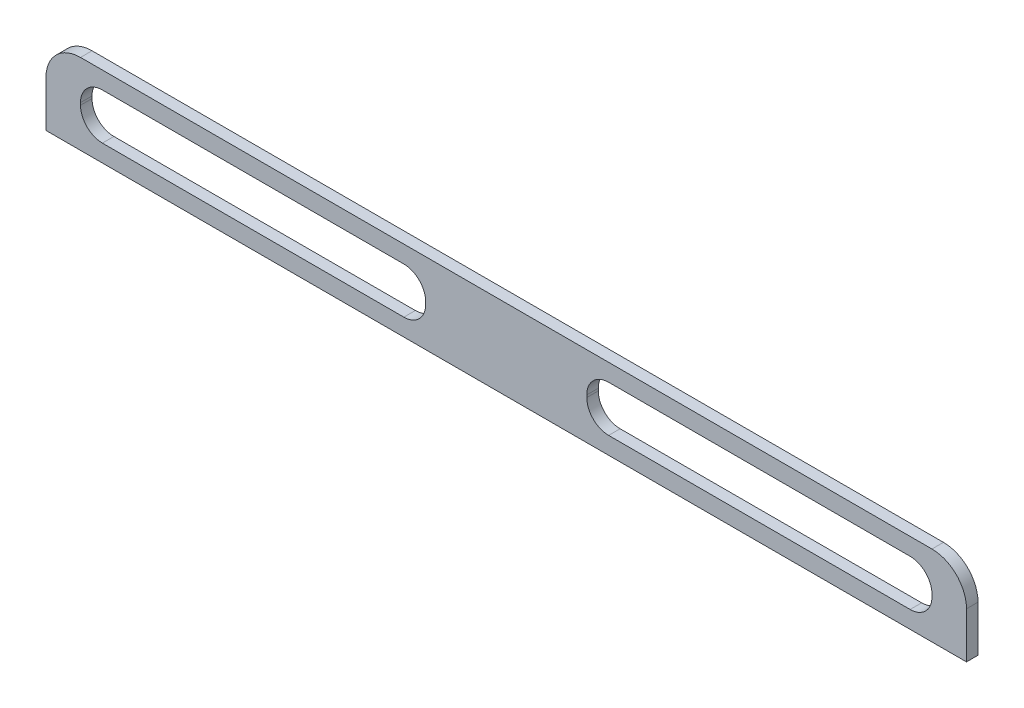
ISO-10303-21;
HEADER;
FILE_DESCRIPTION(('STEP AP214'),'2;1');
FILE_NAME('part.step','',(''),(''),'','','');
FILE_SCHEMA(('AUTOMOTIVE_DESIGN { 1 0 10303 214 1 1 1 1 }'));
ENDSEC;
DATA;
#1=APPLICATION_CONTEXT('core data for automotive mechanical design processes');
#2=APPLICATION_PROTOCOL_DEFINITION('international standard','automotive_design',2000,#1);
#3=PRODUCT_CONTEXT('',#1,'mechanical');
#4=PRODUCT('Part','Part','',(#3));
#5=PRODUCT_RELATED_PRODUCT_CATEGORY('part','',(#4));
#6=PRODUCT_DEFINITION_FORMATION('','',#4);
#7=PRODUCT_DEFINITION_CONTEXT('part definition',#1,'design');
#8=PRODUCT_DEFINITION('design','',#6,#7);
#9=PRODUCT_DEFINITION_SHAPE('','',#8);
#10=(LENGTH_UNIT() NAMED_UNIT(*) SI_UNIT(.MILLI.,.METRE.));
#11=(NAMED_UNIT(*) PLANE_ANGLE_UNIT() SI_UNIT($,.RADIAN.));
#12=(NAMED_UNIT(*) SI_UNIT($,.STERADIAN.) SOLID_ANGLE_UNIT());
#13=UNCERTAINTY_MEASURE_WITH_UNIT(LENGTH_MEASURE(1.E-05),#10,'distance_accuracy_value','');
#14=(GEOMETRIC_REPRESENTATION_CONTEXT(3) GLOBAL_UNCERTAINTY_ASSIGNED_CONTEXT((#13)) GLOBAL_UNIT_ASSIGNED_CONTEXT((#10,
#11,#12)) REPRESENTATION_CONTEXT('',''));
#15=CARTESIAN_POINT('',(0.,0.,0.));
#16=DIRECTION('',(0.,0.,1.));
#17=DIRECTION('',(1.,0.,0.));
#18=AXIS2_PLACEMENT_3D('',#15,#16,#17);
#19=CARTESIAN_POINT('',(400.,-35.0000000000001,-10.));
#20=DIRECTION('',(1.,0.,0.));
#21=DIRECTION('',(0.,0.,-1.));
#22=AXIS2_PLACEMENT_3D('',#19,#20,#21);
#23=PLANE('',#22);
#24=DIRECTION('',(0.,1.,0.));
#25=VECTOR('',#24,1.);
#26=CARTESIAN_POINT('',(400.,-35.0000000000001,0.));
#27=LINE('',#26,#25);
#28=CARTESIAN_POINT('',(400.,-35.0000000000001,0.));
#29=VERTEX_POINT('',#28);
#30=CARTESIAN_POINT('',(400.,5.00000000000013,0.));
#31=VERTEX_POINT('',#30);
#32=EDGE_CURVE('E306',#29,#31,#27,.T.);
#33=ORIENTED_EDGE('',*,*,#32,.F.);
#34=DIRECTION('',(0.,0.,1.));
#35=VECTOR('',#34,1.);
#36=CARTESIAN_POINT('',(400.,-35.0000000000001,-10.));
#37=LINE('',#36,#35);
#38=CARTESIAN_POINT('',(400.,-35.0000000000001,-10.));
#39=VERTEX_POINT('',#38);
#40=EDGE_CURVE('E11',#39,#29,#37,.T.);
#41=ORIENTED_EDGE('',*,*,#40,.F.);
#42=DIRECTION('',(0.,1.,0.));
#43=VECTOR('',#42,1.);
#44=CARTESIAN_POINT('',(400.,-35.0000000000001,-10.));
#45=LINE('',#44,#43);
#46=CARTESIAN_POINT('',(400.,5.00000000000013,-10.));
#47=VERTEX_POINT('',#46);
#48=EDGE_CURVE('E321',#39,#47,#45,.T.);
#49=ORIENTED_EDGE('',*,*,#48,.T.);
#50=DIRECTION('',(0.,0.,1.));
#51=VECTOR('',#50,1.);
#52=CARTESIAN_POINT('',(400.,5.00000000000013,-10.));
#53=LINE('',#52,#51);
#54=EDGE_CURVE('E42',#47,#31,#53,.T.);
#55=ORIENTED_EDGE('',*,*,#54,.T.);
#56=EDGE_LOOP('',(#33,#41,#49,#55));
#57=FACE_BOUND('',#56,.T.);
#58=ADVANCED_FACE('F39',(#57),#23,.T.);
#59=CARTESIAN_POINT('',(400.,-35.0000000000001,-10.));
#60=DIRECTION('',(0.,-1.,0.));
#61=DIRECTION('',(1.,0.,0.));
#62=AXIS2_PLACEMENT_3D('',#59,#60,#61);
#63=PLANE('',#62);
#64=DIRECTION('',(1.,0.,0.));
#65=VECTOR('',#64,1.);
#66=CARTESIAN_POINT('',(400.,-35.0000000000001,0.));
#67=LINE('',#66,#65);
#68=CARTESIAN_POINT('',(-400.,-35.,0.));
#69=VERTEX_POINT('',#68);
#70=EDGE_CURVE('E325',#69,#29,#67,.T.);
#71=ORIENTED_EDGE('',*,*,#70,.F.);
#72=DIRECTION('',(0.,0.,1.));
#73=VECTOR('',#72,1.);
#74=CARTESIAN_POINT('',(-400.,-35.,-10.));
#75=LINE('',#74,#73);
#76=CARTESIAN_POINT('',(-400.,-35.,-10.));
#77=VERTEX_POINT('',#76);
#78=EDGE_CURVE('E47',#77,#69,#75,.T.);
#79=ORIENTED_EDGE('',*,*,#78,.F.);
#80=DIRECTION('',(1.,0.,0.));
#81=VECTOR('',#80,1.);
#82=CARTESIAN_POINT('',(400.,-35.0000000000001,-10.));
#83=LINE('',#82,#81);
#84=EDGE_CURVE('E337',#77,#39,#83,.T.);
#85=ORIENTED_EDGE('',*,*,#84,.T.);
#86=ORIENTED_EDGE('',*,*,#40,.T.);
#87=EDGE_LOOP('',(#71,#79,#85,#86));
#88=FACE_BOUND('',#87,.T.);
#89=ADVANCED_FACE('F374',(#88),#63,.T.);
#90=CARTESIAN_POINT('',(-400.,-35.,-10.));
#91=DIRECTION('',(-1.,0.,0.));
#92=DIRECTION('',(0.,-1.,0.));
#93=AXIS2_PLACEMENT_3D('',#90,#91,#92);
#94=PLANE('',#93);
#95=DIRECTION('',(0.,-1.,0.));
#96=VECTOR('',#95,1.);
#97=CARTESIAN_POINT('',(-400.,-35.,0.));
#98=LINE('',#97,#96);
#99=CARTESIAN_POINT('',(-400.,4.99999999999998,0.));
#100=VERTEX_POINT('',#99);
#101=EDGE_CURVE('E351',#100,#69,#98,.T.);
#102=ORIENTED_EDGE('',*,*,#101,.F.);
#103=DIRECTION('',(0.,0.,1.));
#104=VECTOR('',#103,1.);
#105=CARTESIAN_POINT('',(-400.,4.99999999999998,-10.));
#106=LINE('',#105,#104);
#107=CARTESIAN_POINT('',(-400.,4.99999999999998,-10.));
#108=VERTEX_POINT('',#107);
#109=EDGE_CURVE('E357',#108,#100,#106,.T.);
#110=ORIENTED_EDGE('',*,*,#109,.F.);
#111=DIRECTION('',(0.,-1.,0.));
#112=VECTOR('',#111,1.);
#113=CARTESIAN_POINT('',(-400.,-35.,-10.));
#114=LINE('',#113,#112);
#115=EDGE_CURVE('E334',#108,#77,#114,.T.);
#116=ORIENTED_EDGE('',*,*,#115,.T.);
#117=ORIENTED_EDGE('',*,*,#78,.T.);
#118=EDGE_LOOP('',(#102,#110,#116,#117));
#119=FACE_BOUND('',#118,.T.);
#120=ADVANCED_FACE('F386',(#119),#94,.T.);
#121=CARTESIAN_POINT('',(-370.,4.99999999999998,-10.));
#122=DIRECTION('',(0.,0.,1.));
#123=DIRECTION('',(1.,0.,0.));
#124=AXIS2_PLACEMENT_3D('',#121,#122,#123);
#125=CYLINDRICAL_SURFACE('',#124,30.);
#126=CARTESIAN_POINT('',(-370.,4.99999999999998,0.));
#127=DIRECTION('',(0.,0.,1.));
#128=DIRECTION('',(1.,0.,0.));
#129=AXIS2_PLACEMENT_3D('',#126,#127,#128);
#130=CIRCLE('',#129,30.);
#131=CARTESIAN_POINT('',(-370.,35.,0.));
#132=VERTEX_POINT('',#131);
#133=EDGE_CURVE('E348',#132,#100,#130,.T.);
#134=ORIENTED_EDGE('',*,*,#133,.F.);
#135=DIRECTION('',(0.,0.,1.));
#136=VECTOR('',#135,1.);
#137=CARTESIAN_POINT('',(-370.,35.,-10.));
#138=LINE('',#137,#136);
#139=CARTESIAN_POINT('',(-370.,35.,-10.));
#140=VERTEX_POINT('',#139);
#141=EDGE_CURVE('E359',#140,#132,#138,.T.);
#142=ORIENTED_EDGE('',*,*,#141,.F.);
#143=CARTESIAN_POINT('',(-370.,4.99999999999998,-10.));
#144=DIRECTION('',(0.,0.,1.));
#145=DIRECTION('',(1.,0.,0.));
#146=AXIS2_PLACEMENT_3D('',#143,#144,#145);
#147=CIRCLE('',#146,30.);
#148=EDGE_CURVE('E331',#140,#108,#147,.T.);
#149=ORIENTED_EDGE('',*,*,#148,.T.);
#150=ORIENTED_EDGE('',*,*,#109,.T.);
#151=EDGE_LOOP('',(#134,#142,#149,#150));
#152=FACE_BOUND('',#151,.T.);
#153=ADVANCED_FACE('F384',(#152),#125,.T.);
#154=CARTESIAN_POINT('',(370.,35.0000000000001,-10.));
#155=DIRECTION('',(0.,1.,0.));
#156=DIRECTION('',(-1.,0.,0.));
#157=AXIS2_PLACEMENT_3D('',#154,#155,#156);
#158=PLANE('',#157);
#159=DIRECTION('',(-1.,0.,0.));
#160=VECTOR('',#159,1.);
#161=CARTESIAN_POINT('',(370.,35.0000000000001,0.));
#162=LINE('',#161,#160);
#163=CARTESIAN_POINT('',(370.,35.0000000000001,0.));
#164=VERTEX_POINT('',#163);
#165=EDGE_CURVE('E345',#164,#132,#162,.T.);
#166=ORIENTED_EDGE('',*,*,#165,.F.);
#167=DIRECTION('',(0.,0.,1.));
#168=VECTOR('',#167,1.);
#169=CARTESIAN_POINT('',(370.,35.0000000000001,-10.));
#170=LINE('',#169,#168);
#171=CARTESIAN_POINT('',(370.,35.0000000000001,-10.));
#172=VERTEX_POINT('',#171);
#173=EDGE_CURVE('E360',#172,#164,#170,.T.);
#174=ORIENTED_EDGE('',*,*,#173,.F.);
#175=DIRECTION('',(-1.,0.,0.));
#176=VECTOR('',#175,1.);
#177=CARTESIAN_POINT('',(370.,35.0000000000001,-10.));
#178=LINE('',#177,#176);
#179=EDGE_CURVE('E328',#172,#140,#178,.T.);
#180=ORIENTED_EDGE('',*,*,#179,.T.);
#181=ORIENTED_EDGE('',*,*,#141,.T.);
#182=EDGE_LOOP('',(#166,#174,#180,#181));
#183=FACE_BOUND('',#182,.T.);
#184=ADVANCED_FACE('F381',(#183),#158,.T.);
#185=CARTESIAN_POINT('',(370.,5.00000000000013,-10.));
#186=DIRECTION('',(0.,0.,1.));
#187=DIRECTION('',(1.,0.,0.));
#188=AXIS2_PLACEMENT_3D('',#185,#186,#187);
#189=CYLINDRICAL_SURFACE('',#188,30.);
#190=CARTESIAN_POINT('',(370.,5.00000000000013,0.));
#191=DIRECTION('',(0.,0.,1.));
#192=DIRECTION('',(1.,0.,0.));
#193=AXIS2_PLACEMENT_3D('',#190,#191,#192);
#194=CIRCLE('',#193,30.);
#195=EDGE_CURVE('E342',#31,#164,#194,.T.);
#196=ORIENTED_EDGE('',*,*,#195,.F.);
#197=ORIENTED_EDGE('',*,*,#54,.F.);
#198=CARTESIAN_POINT('',(370.,5.00000000000013,-10.));
#199=DIRECTION('',(0.,0.,1.));
#200=DIRECTION('',(1.,0.,0.));
#201=AXIS2_PLACEMENT_3D('',#198,#199,#200);
#202=CIRCLE('',#201,30.);
#203=EDGE_CURVE('E324',#47,#172,#202,.T.);
#204=ORIENTED_EDGE('',*,*,#203,.T.);
#205=ORIENTED_EDGE('',*,*,#173,.T.);
#206=EDGE_LOOP('',(#196,#197,#204,#205));
#207=FACE_BOUND('',#206,.T.);
#208=ADVANCED_FACE('F368',(#207),#189,.T.);
#209=CARTESIAN_POINT('',(370.,5.00000000000013,-10.));
#210=DIRECTION('',(0.,0.,1.));
#211=DIRECTION('',(1.,0.,0.));
#212=AXIS2_PLACEMENT_3D('',#209,#210,#211);
#213=PLANE('',#212);
#214=DIRECTION('',(0.,-1.,0.));
#215=VECTOR('',#214,1.);
#216=CARTESIAN_POINT('',(70.0000000000005,0.999999999999421,-10.));
#217=LINE('',#216,#215);
#218=CARTESIAN_POINT('',(70.0000000000005,0.999999999999429,-10.));
#219=VERTEX_POINT('',#218);
#220=CARTESIAN_POINT('',(70.0000000000005,-0.999999999999907,-10.));
#221=VERTEX_POINT('',#220);
#222=EDGE_CURVE('E196',#219,#221,#217,.T.);
#223=ORIENTED_EDGE('',*,*,#222,.T.);
#224=CARTESIAN_POINT('',(89.0000000000004,-1.00000000000004,-10.));
#225=DIRECTION('',(0.,0.,1.));
#226=DIRECTION('',(-1.,0.,0.));
#227=AXIS2_PLACEMENT_3D('',#224,#225,#226);
#228=CIRCLE('',#227,19.);
#229=CARTESIAN_POINT('',(89.0000000000006,-20.,-10.));
#230=VERTEX_POINT('',#229);
#231=EDGE_CURVE('E190',#221,#230,#228,.T.);
#232=ORIENTED_EDGE('',*,*,#231,.T.);
#233=DIRECTION('',(1.,0.,0.));
#234=VECTOR('',#233,1.);
#235=CARTESIAN_POINT('',(351.,-20.,-10.));
#236=LINE('',#235,#234);
#237=CARTESIAN_POINT('',(351.,-20.,-10.));
#238=VERTEX_POINT('',#237);
#239=EDGE_CURVE('E199',#230,#238,#236,.T.);
#240=ORIENTED_EDGE('',*,*,#239,.T.);
#241=CARTESIAN_POINT('',(351.,-1.00000000000001,-10.));
#242=DIRECTION('',(0.,0.,1.));
#243=DIRECTION('',(1.,0.,0.));
#244=AXIS2_PLACEMENT_3D('',#241,#242,#243);
#245=CIRCLE('',#244,19.);
#246=CARTESIAN_POINT('',(370.,-1.00000000000001,-10.));
#247=VERTEX_POINT('',#246);
#248=EDGE_CURVE('E55',#238,#247,#245,.T.);
#249=ORIENTED_EDGE('',*,*,#248,.T.);
#250=DIRECTION('',(0.,1.,0.));
#251=VECTOR('',#250,1.);
#252=CARTESIAN_POINT('',(370.,0.999999999999841,-10.));
#253=LINE('',#252,#251);
#254=CARTESIAN_POINT('',(370.,0.999999999999841,-10.));
#255=VERTEX_POINT('',#254);
#256=EDGE_CURVE('E214',#247,#255,#253,.T.);
#257=ORIENTED_EDGE('',*,*,#256,.T.);
#258=CARTESIAN_POINT('',(351.,0.999999999999973,-10.));
#259=DIRECTION('',(0.,0.,1.));
#260=DIRECTION('',(-1.,0.,0.));
#261=AXIS2_PLACEMENT_3D('',#258,#259,#260);
#262=CIRCLE('',#261,19.);
#263=CARTESIAN_POINT('',(351.,20.,-10.));
#264=VERTEX_POINT('',#263);
#265=EDGE_CURVE('E217',#255,#264,#262,.T.);
#266=ORIENTED_EDGE('',*,*,#265,.T.);
#267=DIRECTION('',(-1.,0.,0.));
#268=VECTOR('',#267,1.);
#269=CARTESIAN_POINT('',(351.,20.,-10.));
#270=LINE('',#269,#268);
#271=CARTESIAN_POINT('',(89.0000000000006,19.9999999999996,-10.));
#272=VERTEX_POINT('',#271);
#273=EDGE_CURVE('E220',#264,#272,#270,.T.);
#274=ORIENTED_EDGE('',*,*,#273,.T.);
#275=CARTESIAN_POINT('',(89.0000000000004,0.999999999999553,-10.));
#276=DIRECTION('',(0.,0.,1.));
#277=DIRECTION('',(1.,0.,0.));
#278=AXIS2_PLACEMENT_3D('',#275,#276,#277);
#279=CIRCLE('',#278,19.);
#280=EDGE_CURVE('E223',#272,#219,#279,.T.);
#281=ORIENTED_EDGE('',*,*,#280,.T.);
#282=EDGE_LOOP('',(#223,#232,#240,#249,#257,#266,#274,#281));
#283=FACE_BOUND('',#282,.T.);
#284=DIRECTION('',(1.,0.,0.));
#285=VECTOR('',#284,1.);
#286=CARTESIAN_POINT('',(-88.9999999999998,-19.9999999999999,-10.));
#287=LINE('',#286,#285);
#288=CARTESIAN_POINT('',(-351.,-19.9999999999999,-10.));
#289=VERTEX_POINT('',#288);
#290=CARTESIAN_POINT('',(-88.9999999999998,-19.9999999999999,-10.));
#291=VERTEX_POINT('',#290);
#292=EDGE_CURVE('E279',#289,#291,#287,.T.);
#293=ORIENTED_EDGE('',*,*,#292,.T.);
#294=CARTESIAN_POINT('',(-88.9999999999997,-0.999999999999866,-10.));
#295=DIRECTION('',(0.,0.,1.));
#296=DIRECTION('',(1.,0.,0.));
#297=AXIS2_PLACEMENT_3D('',#294,#295,#296);
#298=CIRCLE('',#297,19.);
#299=CARTESIAN_POINT('',(-69.9999999999997,-0.999999999999727,-10.));
#300=VERTEX_POINT('',#299);
#301=EDGE_CURVE('E257',#291,#300,#298,.T.);
#302=ORIENTED_EDGE('',*,*,#301,.T.);
#303=DIRECTION('',(0.,1.,0.));
#304=VECTOR('',#303,1.);
#305=CARTESIAN_POINT('',(-69.9999999999997,0.999999999999789,-10.));
#306=LINE('',#305,#304);
#307=CARTESIAN_POINT('',(-69.9999999999997,0.999999999999792,-10.));
#308=VERTEX_POINT('',#307);
#309=EDGE_CURVE('E260',#300,#308,#306,.T.);
#310=ORIENTED_EDGE('',*,*,#309,.T.);
#311=CARTESIAN_POINT('',(-88.9999999999997,0.999999999999925,-10.));
#312=DIRECTION('',(0.,0.,1.));
#313=DIRECTION('',(-1.,0.,0.));
#314=AXIS2_PLACEMENT_3D('',#311,#312,#313);
#315=CIRCLE('',#314,19.);
#316=CARTESIAN_POINT('',(-88.9999999999998,19.9999999999999,-10.));
#317=VERTEX_POINT('',#316);
#318=EDGE_CURVE('E264',#308,#317,#315,.T.);
#319=ORIENTED_EDGE('',*,*,#318,.T.);
#320=DIRECTION('',(-1.,0.,0.));
#321=VECTOR('',#320,1.);
#322=CARTESIAN_POINT('',(-88.9999999999998,19.9999999999999,-10.));
#323=LINE('',#322,#321);
#324=CARTESIAN_POINT('',(-351.,19.9999999999999,-10.));
#325=VERTEX_POINT('',#324);
#326=EDGE_CURVE('E267',#317,#325,#323,.T.);
#327=ORIENTED_EDGE('',*,*,#326,.T.);
#328=CARTESIAN_POINT('',(-351.,0.999999999999883,-10.));
#329=DIRECTION('',(0.,0.,1.));
#330=DIRECTION('',(1.,0.,0.));
#331=AXIS2_PLACEMENT_3D('',#328,#329,#330);
#332=CIRCLE('',#331,19.);
#333=CARTESIAN_POINT('',(-370.,0.999999999999744,-10.));
#334=VERTEX_POINT('',#333);
#335=EDGE_CURVE('E270',#325,#334,#332,.T.);
#336=ORIENTED_EDGE('',*,*,#335,.T.);
#337=DIRECTION('',(0.,-1.,0.));
#338=VECTOR('',#337,1.);
#339=CARTESIAN_POINT('',(-370.,0.999999999999744,-10.));
#340=LINE('',#339,#338);
#341=CARTESIAN_POINT('',(-370.,-0.999999999999907,-10.));
#342=VERTEX_POINT('',#341);
#343=EDGE_CURVE('E273',#334,#342,#340,.T.);
#344=ORIENTED_EDGE('',*,*,#343,.T.);
#345=CARTESIAN_POINT('',(-351.,-0.999999999999907,-10.));
#346=DIRECTION('',(0.,0.,1.));
#347=DIRECTION('',(-1.,0.,0.));
#348=AXIS2_PLACEMENT_3D('',#345,#346,#347);
#349=CIRCLE('',#348,19.);
#350=EDGE_CURVE('E276',#342,#289,#349,.T.);
#351=ORIENTED_EDGE('',*,*,#350,.T.);
#352=EDGE_LOOP('',(#293,#302,#310,#319,#327,#336,#344,#351));
#353=FACE_BOUND('',#352,.T.);
#354=ORIENTED_EDGE('',*,*,#48,.F.);
#355=ORIENTED_EDGE('',*,*,#84,.F.);
#356=ORIENTED_EDGE('',*,*,#115,.F.);
#357=ORIENTED_EDGE('',*,*,#148,.F.);
#358=ORIENTED_EDGE('',*,*,#179,.F.);
#359=ORIENTED_EDGE('',*,*,#203,.F.);
#360=EDGE_LOOP('',(#354,#355,#356,#357,#358,#359));
#361=FACE_BOUND('',#360,.T.);
#362=ADVANCED_FACE('F203',(#283,#353,#361),#213,.F.);
#363=CARTESIAN_POINT('',(370.,5.00000000000013,0.));
#364=DIRECTION('',(0.,0.,1.));
#365=DIRECTION('',(1.,0.,0.));
#366=AXIS2_PLACEMENT_3D('',#363,#364,#365);
#367=PLANE('',#366);
#368=CARTESIAN_POINT('',(89.0000000000004,-1.00000000000004,0.));
#369=DIRECTION('',(0.,0.,1.));
#370=DIRECTION('',(-1.,0.,0.));
#371=AXIS2_PLACEMENT_3D('',#368,#369,#370);
#372=CIRCLE('',#371,19.);
#373=CARTESIAN_POINT('',(70.0000000000005,-0.999999999999907,0.));
#374=VERTEX_POINT('',#373);
#375=CARTESIAN_POINT('',(89.0000000000006,-20.,0.));
#376=VERTEX_POINT('',#375);
#377=EDGE_CURVE('E63',#374,#376,#372,.T.);
#378=ORIENTED_EDGE('',*,*,#377,.F.);
#379=DIRECTION('',(0.,-1.,0.));
#380=VECTOR('',#379,1.);
#381=CARTESIAN_POINT('',(70.0000000000005,0.999999999999421,0.));
#382=LINE('',#381,#380);
#383=CARTESIAN_POINT('',(70.0000000000005,0.999999999999429,0.));
#384=VERTEX_POINT('',#383);
#385=EDGE_CURVE('E207',#384,#374,#382,.T.);
#386=ORIENTED_EDGE('',*,*,#385,.F.);
#387=CARTESIAN_POINT('',(89.0000000000004,0.999999999999553,0.));
#388=DIRECTION('',(0.,0.,1.));
#389=DIRECTION('',(1.,0.,0.));
#390=AXIS2_PLACEMENT_3D('',#387,#388,#389);
#391=CIRCLE('',#390,19.);
#392=CARTESIAN_POINT('',(89.0000000000006,19.9999999999996,0.));
#393=VERTEX_POINT('',#392);
#394=EDGE_CURVE('E210',#393,#384,#391,.T.);
#395=ORIENTED_EDGE('',*,*,#394,.F.);
#396=DIRECTION('',(-1.,0.,0.));
#397=VECTOR('',#396,1.);
#398=CARTESIAN_POINT('',(351.,20.,0.));
#399=LINE('',#398,#397);
#400=CARTESIAN_POINT('',(351.,20.,0.));
#401=VERTEX_POINT('',#400);
#402=EDGE_CURVE('E238',#401,#393,#399,.T.);
#403=ORIENTED_EDGE('',*,*,#402,.F.);
#404=CARTESIAN_POINT('',(351.,0.999999999999973,0.));
#405=DIRECTION('',(0.,0.,1.));
#406=DIRECTION('',(-1.,0.,0.));
#407=AXIS2_PLACEMENT_3D('',#404,#405,#406);
#408=CIRCLE('',#407,19.);
#409=CARTESIAN_POINT('',(370.,0.999999999999841,0.));
#410=VERTEX_POINT('',#409);
#411=EDGE_CURVE('E235',#410,#401,#408,.T.);
#412=ORIENTED_EDGE('',*,*,#411,.F.);
#413=DIRECTION('',(0.,1.,0.));
#414=VECTOR('',#413,1.);
#415=CARTESIAN_POINT('',(370.,0.999999999999841,0.));
#416=LINE('',#415,#414);
#417=CARTESIAN_POINT('',(370.,-1.00000000000001,0.));
#418=VERTEX_POINT('',#417);
#419=EDGE_CURVE('E232',#418,#410,#416,.T.);
#420=ORIENTED_EDGE('',*,*,#419,.F.);
#421=CARTESIAN_POINT('',(351.,-1.00000000000001,0.));
#422=DIRECTION('',(0.,0.,1.));
#423=DIRECTION('',(1.,0.,0.));
#424=AXIS2_PLACEMENT_3D('',#421,#422,#423);
#425=CIRCLE('',#424,19.);
#426=CARTESIAN_POINT('',(351.,-20.,0.));
#427=VERTEX_POINT('',#426);
#428=EDGE_CURVE('E229',#427,#418,#425,.T.);
#429=ORIENTED_EDGE('',*,*,#428,.F.);
#430=DIRECTION('',(1.,0.,0.));
#431=VECTOR('',#430,1.);
#432=CARTESIAN_POINT('',(351.,-20.,0.));
#433=LINE('',#432,#431);
#434=EDGE_CURVE('E227',#376,#427,#433,.T.);
#435=ORIENTED_EDGE('',*,*,#434,.F.);
#436=EDGE_LOOP('',(#378,#386,#395,#403,#412,#420,#429,#435));
#437=FACE_BOUND('',#436,.T.);
#438=CARTESIAN_POINT('',(-88.9999999999997,-0.999999999999866,0.));
#439=DIRECTION('',(0.,0.,1.));
#440=DIRECTION('',(1.,0.,0.));
#441=AXIS2_PLACEMENT_3D('',#438,#439,#440);
#442=CIRCLE('',#441,19.);
#443=CARTESIAN_POINT('',(-88.9999999999998,-19.9999999999999,0.));
#444=VERTEX_POINT('',#443);
#445=CARTESIAN_POINT('',(-69.9999999999997,-0.999999999999727,0.));
#446=VERTEX_POINT('',#445);
#447=EDGE_CURVE('E245',#444,#446,#442,.T.);
#448=ORIENTED_EDGE('',*,*,#447,.F.);
#449=DIRECTION('',(1.,0.,0.));
#450=VECTOR('',#449,1.);
#451=CARTESIAN_POINT('',(-88.9999999999998,-19.9999999999999,0.));
#452=LINE('',#451,#450);
#453=CARTESIAN_POINT('',(-351.,-19.9999999999999,0.));
#454=VERTEX_POINT('',#453);
#455=EDGE_CURVE('E261',#454,#444,#452,.T.);
#456=ORIENTED_EDGE('',*,*,#455,.F.);
#457=CARTESIAN_POINT('',(-351.,-0.999999999999907,0.));
#458=DIRECTION('',(0.,0.,1.));
#459=DIRECTION('',(-1.,0.,0.));
#460=AXIS2_PLACEMENT_3D('',#457,#458,#459);
#461=CIRCLE('',#460,19.);
#462=CARTESIAN_POINT('',(-370.,-0.999999999999907,0.));
#463=VERTEX_POINT('',#462);
#464=EDGE_CURVE('E299',#463,#454,#461,.T.);
#465=ORIENTED_EDGE('',*,*,#464,.F.);
#466=DIRECTION('',(0.,-1.,0.));
#467=VECTOR('',#466,1.);
#468=CARTESIAN_POINT('',(-370.,0.999999999999744,0.));
#469=LINE('',#468,#467);
#470=CARTESIAN_POINT('',(-370.,0.999999999999744,0.));
#471=VERTEX_POINT('',#470);
#472=EDGE_CURVE('E296',#471,#463,#469,.T.);
#473=ORIENTED_EDGE('',*,*,#472,.F.);
#474=CARTESIAN_POINT('',(-351.,0.999999999999883,0.));
#475=DIRECTION('',(0.,0.,1.));
#476=DIRECTION('',(1.,0.,0.));
#477=AXIS2_PLACEMENT_3D('',#474,#475,#476);
#478=CIRCLE('',#477,19.);
#479=CARTESIAN_POINT('',(-351.,19.9999999999999,0.));
#480=VERTEX_POINT('',#479);
#481=EDGE_CURVE('E293',#480,#471,#478,.T.);
#482=ORIENTED_EDGE('',*,*,#481,.F.);
#483=DIRECTION('',(-1.,0.,0.));
#484=VECTOR('',#483,1.);
#485=CARTESIAN_POINT('',(-88.9999999999998,19.9999999999999,0.));
#486=LINE('',#485,#484);
#487=CARTESIAN_POINT('',(-88.9999999999998,19.9999999999999,0.));
#488=VERTEX_POINT('',#487);
#489=EDGE_CURVE('E290',#488,#480,#486,.T.);
#490=ORIENTED_EDGE('',*,*,#489,.F.);
#491=CARTESIAN_POINT('',(-88.9999999999997,0.999999999999925,0.));
#492=DIRECTION('',(0.,0.,1.));
#493=DIRECTION('',(-1.,0.,0.));
#494=AXIS2_PLACEMENT_3D('',#491,#492,#493);
#495=CIRCLE('',#494,19.);
#496=CARTESIAN_POINT('',(-69.9999999999997,0.999999999999792,0.));
#497=VERTEX_POINT('',#496);
#498=EDGE_CURVE('E287',#497,#488,#495,.T.);
#499=ORIENTED_EDGE('',*,*,#498,.F.);
#500=DIRECTION('',(0.,1.,0.));
#501=VECTOR('',#500,1.);
#502=CARTESIAN_POINT('',(-69.9999999999997,0.999999999999789,0.));
#503=LINE('',#502,#501);
#504=EDGE_CURVE('E284',#446,#497,#503,.T.);
#505=ORIENTED_EDGE('',*,*,#504,.F.);
#506=EDGE_LOOP('',(#448,#456,#465,#473,#482,#490,#499,#505));
#507=FACE_BOUND('',#506,.T.);
#508=ORIENTED_EDGE('',*,*,#32,.T.);
#509=ORIENTED_EDGE('',*,*,#195,.T.);
#510=ORIENTED_EDGE('',*,*,#165,.T.);
#511=ORIENTED_EDGE('',*,*,#133,.T.);
#512=ORIENTED_EDGE('',*,*,#101,.T.);
#513=ORIENTED_EDGE('',*,*,#70,.T.);
#514=EDGE_LOOP('',(#508,#509,#510,#511,#512,#513));
#515=FACE_BOUND('',#514,.T.);
#516=ADVANCED_FACE('F370',(#437,#507,#515),#367,.T.);
#517=CARTESIAN_POINT('',(-88.9999999999997,-0.999999999999866,-10.));
#518=DIRECTION('',(0.,0.,1.));
#519=DIRECTION('',(1.,0.,0.));
#520=AXIS2_PLACEMENT_3D('',#517,#518,#519);
#521=CYLINDRICAL_SURFACE('',#520,19.);
#522=ORIENTED_EDGE('',*,*,#447,.T.);
#523=DIRECTION('',(0.,0.,1.));
#524=VECTOR('',#523,1.);
#525=CARTESIAN_POINT('',(-69.9999999999997,-0.999999999999727,-10.));
#526=LINE('',#525,#524);
#527=EDGE_CURVE('E282',#300,#446,#526,.T.);
#528=ORIENTED_EDGE('',*,*,#527,.F.);
#529=ORIENTED_EDGE('',*,*,#301,.F.);
#530=DIRECTION('',(0.,0.,1.));
#531=VECTOR('',#530,1.);
#532=CARTESIAN_POINT('',(-88.9999999999998,-19.9999999999999,-10.));
#533=LINE('',#532,#531);
#534=EDGE_CURVE('E304',#291,#444,#533,.T.);
#535=ORIENTED_EDGE('',*,*,#534,.T.);
#536=EDGE_LOOP('',(#522,#528,#529,#535));
#537=FACE_BOUND('',#536,.T.);
#538=ADVANCED_FACE('F450',(#537),#521,.F.);
#539=CARTESIAN_POINT('',(-88.9999999999998,-19.9999999999999,-10.));
#540=DIRECTION('',(0.,-1.,0.));
#541=DIRECTION('',(1.,0.,0.));
#542=AXIS2_PLACEMENT_3D('',#539,#540,#541);
#543=PLANE('',#542);
#544=ORIENTED_EDGE('',*,*,#455,.T.);
#545=ORIENTED_EDGE('',*,*,#534,.F.);
#546=ORIENTED_EDGE('',*,*,#292,.F.);
#547=DIRECTION('',(0.,0.,1.));
#548=VECTOR('',#547,1.);
#549=CARTESIAN_POINT('',(-351.,-19.9999999999999,-10.));
#550=LINE('',#549,#548);
#551=EDGE_CURVE('E307',#289,#454,#550,.T.);
#552=ORIENTED_EDGE('',*,*,#551,.T.);
#553=EDGE_LOOP('',(#544,#545,#546,#552));
#554=FACE_BOUND('',#553,.T.);
#555=ADVANCED_FACE('F461',(#554),#543,.F.);
#556=CARTESIAN_POINT('',(-351.,-0.999999999999907,-10.));
#557=DIRECTION('',(0.,0.,1.));
#558=DIRECTION('',(1.,0.,0.));
#559=AXIS2_PLACEMENT_3D('',#556,#557,#558);
#560=CYLINDRICAL_SURFACE('',#559,19.);
#561=ORIENTED_EDGE('',*,*,#464,.T.);
#562=ORIENTED_EDGE('',*,*,#551,.F.);
#563=ORIENTED_EDGE('',*,*,#350,.F.);
#564=DIRECTION('',(0.,0.,1.));
#565=VECTOR('',#564,1.);
#566=CARTESIAN_POINT('',(-370.,-0.999999999999907,-10.));
#567=LINE('',#566,#565);
#568=EDGE_CURVE('E309',#342,#463,#567,.T.);
#569=ORIENTED_EDGE('',*,*,#568,.T.);
#570=EDGE_LOOP('',(#561,#562,#563,#569));
#571=FACE_BOUND('',#570,.T.);
#572=ADVANCED_FACE('F472',(#571),#560,.F.);
#573=CARTESIAN_POINT('',(-370.,0.999999999999744,-10.));
#574=DIRECTION('',(-1.,0.,0.));
#575=DIRECTION('',(0.,0.,1.));
#576=AXIS2_PLACEMENT_3D('',#573,#574,#575);
#577=PLANE('',#576);
#578=ORIENTED_EDGE('',*,*,#472,.T.);
#579=ORIENTED_EDGE('',*,*,#568,.F.);
#580=ORIENTED_EDGE('',*,*,#343,.F.);
#581=DIRECTION('',(0.,0.,1.));
#582=VECTOR('',#581,1.);
#583=CARTESIAN_POINT('',(-370.,0.999999999999744,-10.));
#584=LINE('',#583,#582);
#585=EDGE_CURVE('E311',#334,#471,#584,.T.);
#586=ORIENTED_EDGE('',*,*,#585,.T.);
#587=EDGE_LOOP('',(#578,#579,#580,#586));
#588=FACE_BOUND('',#587,.T.);
#589=ADVANCED_FACE('F483',(#588),#577,.F.);
#590=CARTESIAN_POINT('',(-351.,0.999999999999883,-10.));
#591=DIRECTION('',(0.,0.,1.));
#592=DIRECTION('',(1.,0.,0.));
#593=AXIS2_PLACEMENT_3D('',#590,#591,#592);
#594=CYLINDRICAL_SURFACE('',#593,19.);
#595=ORIENTED_EDGE('',*,*,#481,.T.);
#596=ORIENTED_EDGE('',*,*,#585,.F.);
#597=ORIENTED_EDGE('',*,*,#335,.F.);
#598=DIRECTION('',(0.,0.,1.));
#599=VECTOR('',#598,1.);
#600=CARTESIAN_POINT('',(-351.,19.9999999999999,-10.));
#601=LINE('',#600,#599);
#602=EDGE_CURVE('E313',#325,#480,#601,.T.);
#603=ORIENTED_EDGE('',*,*,#602,.T.);
#604=EDGE_LOOP('',(#595,#596,#597,#603));
#605=FACE_BOUND('',#604,.T.);
#606=ADVANCED_FACE('F494',(#605),#594,.F.);
#607=CARTESIAN_POINT('',(-88.9999999999998,19.9999999999999,-10.));
#608=DIRECTION('',(0.,1.,0.));
#609=DIRECTION('',(-1.,0.,0.));
#610=AXIS2_PLACEMENT_3D('',#607,#608,#609);
#611=PLANE('',#610);
#612=ORIENTED_EDGE('',*,*,#489,.T.);
#613=ORIENTED_EDGE('',*,*,#602,.F.);
#614=ORIENTED_EDGE('',*,*,#326,.F.);
#615=DIRECTION('',(0.,0.,1.));
#616=VECTOR('',#615,1.);
#617=CARTESIAN_POINT('',(-88.9999999999998,19.9999999999999,-10.));
#618=LINE('',#617,#616);
#619=EDGE_CURVE('E315',#317,#488,#618,.T.);
#620=ORIENTED_EDGE('',*,*,#619,.T.);
#621=EDGE_LOOP('',(#612,#613,#614,#620));
#622=FACE_BOUND('',#621,.T.);
#623=ADVANCED_FACE('F505',(#622),#611,.F.);
#624=CARTESIAN_POINT('',(-88.9999999999997,0.999999999999925,-10.));
#625=DIRECTION('',(0.,0.,1.));
#626=DIRECTION('',(1.,0.,0.));
#627=AXIS2_PLACEMENT_3D('',#624,#625,#626);
#628=CYLINDRICAL_SURFACE('',#627,19.);
#629=ORIENTED_EDGE('',*,*,#498,.T.);
#630=ORIENTED_EDGE('',*,*,#619,.F.);
#631=ORIENTED_EDGE('',*,*,#318,.F.);
#632=DIRECTION('',(0.,0.,1.));
#633=VECTOR('',#632,1.);
#634=CARTESIAN_POINT('',(-69.9999999999997,0.999999999999792,-10.));
#635=LINE('',#634,#633);
#636=EDGE_CURVE('E317',#308,#497,#635,.T.);
#637=ORIENTED_EDGE('',*,*,#636,.T.);
#638=EDGE_LOOP('',(#629,#630,#631,#637));
#639=FACE_BOUND('',#638,.T.);
#640=ADVANCED_FACE('F516',(#639),#628,.F.);
#641=CARTESIAN_POINT('',(-69.9999999999997,0.999999999999789,-10.));
#642=DIRECTION('',(1.,0.,0.));
#643=DIRECTION('',(0.,0.,-1.));
#644=AXIS2_PLACEMENT_3D('',#641,#642,#643);
#645=PLANE('',#644);
#646=ORIENTED_EDGE('',*,*,#504,.T.);
#647=ORIENTED_EDGE('',*,*,#636,.F.);
#648=ORIENTED_EDGE('',*,*,#309,.F.);
#649=ORIENTED_EDGE('',*,*,#527,.T.);
#650=EDGE_LOOP('',(#646,#647,#648,#649));
#651=FACE_BOUND('',#650,.T.);
#652=ADVANCED_FACE('F527',(#651),#645,.F.);
#653=CARTESIAN_POINT('',(89.0000000000004,-1.00000000000004,-10.));
#654=DIRECTION('',(0.,0.,1.));
#655=DIRECTION('',(1.,0.,0.));
#656=AXIS2_PLACEMENT_3D('',#653,#654,#655);
#657=CYLINDRICAL_SURFACE('',#656,19.);
#658=ORIENTED_EDGE('',*,*,#377,.T.);
#659=DIRECTION('',(0.,0.,1.));
#660=VECTOR('',#659,1.);
#661=CARTESIAN_POINT('',(89.0000000000006,-20.,-10.));
#662=LINE('',#661,#660);
#663=EDGE_CURVE('E186',#230,#376,#662,.T.);
#664=ORIENTED_EDGE('',*,*,#663,.F.);
#665=ORIENTED_EDGE('',*,*,#231,.F.);
#666=DIRECTION('',(0.,0.,1.));
#667=VECTOR('',#666,1.);
#668=CARTESIAN_POINT('',(70.0000000000005,-0.999999999999907,-10.));
#669=LINE('',#668,#667);
#670=EDGE_CURVE('E243',#221,#374,#669,.T.);
#671=ORIENTED_EDGE('',*,*,#670,.T.);
#672=EDGE_LOOP('',(#658,#664,#665,#671));
#673=FACE_BOUND('',#672,.T.);
#674=ADVANCED_FACE('F188',(#673),#657,.F.);
#675=CARTESIAN_POINT('',(70.0000000000005,0.999999999999421,-10.));
#676=DIRECTION('',(-1.,0.,0.));
#677=DIRECTION('',(0.,0.,1.));
#678=AXIS2_PLACEMENT_3D('',#675,#676,#677);
#679=PLANE('',#678);
#680=ORIENTED_EDGE('',*,*,#385,.T.);
#681=ORIENTED_EDGE('',*,*,#670,.F.);
#682=ORIENTED_EDGE('',*,*,#222,.F.);
#683=DIRECTION('',(0.,0.,1.));
#684=VECTOR('',#683,1.);
#685=CARTESIAN_POINT('',(70.0000000000005,0.999999999999429,-10.));
#686=LINE('',#685,#684);
#687=EDGE_CURVE('E246',#219,#384,#686,.T.);
#688=ORIENTED_EDGE('',*,*,#687,.T.);
#689=EDGE_LOOP('',(#680,#681,#682,#688));
#690=FACE_BOUND('',#689,.T.);
#691=ADVANCED_FACE('F548',(#690),#679,.F.);
#692=CARTESIAN_POINT('',(89.0000000000004,0.999999999999553,-10.));
#693=DIRECTION('',(0.,0.,1.));
#694=DIRECTION('',(1.,0.,0.));
#695=AXIS2_PLACEMENT_3D('',#692,#693,#694);
#696=CYLINDRICAL_SURFACE('',#695,19.);
#697=ORIENTED_EDGE('',*,*,#394,.T.);
#698=ORIENTED_EDGE('',*,*,#687,.F.);
#699=ORIENTED_EDGE('',*,*,#280,.F.);
#700=DIRECTION('',(0.,0.,1.));
#701=VECTOR('',#700,1.);
#702=CARTESIAN_POINT('',(89.0000000000006,19.9999999999996,-10.));
#703=LINE('',#702,#701);
#704=EDGE_CURVE('E248',#272,#393,#703,.T.);
#705=ORIENTED_EDGE('',*,*,#704,.T.);
#706=EDGE_LOOP('',(#697,#698,#699,#705));
#707=FACE_BOUND('',#706,.T.);
#708=ADVANCED_FACE('F558',(#707),#696,.F.);
#709=CARTESIAN_POINT('',(351.,20.,-10.));
#710=DIRECTION('',(0.,1.,0.));
#711=DIRECTION('',(-1.,0.,0.));
#712=AXIS2_PLACEMENT_3D('',#709,#710,#711);
#713=PLANE('',#712);
#714=ORIENTED_EDGE('',*,*,#402,.T.);
#715=ORIENTED_EDGE('',*,*,#704,.F.);
#716=ORIENTED_EDGE('',*,*,#273,.F.);
#717=DIRECTION('',(0.,0.,1.));
#718=VECTOR('',#717,1.);
#719=CARTESIAN_POINT('',(351.,20.,-10.));
#720=LINE('',#719,#718);
#721=EDGE_CURVE('E250',#264,#401,#720,.T.);
#722=ORIENTED_EDGE('',*,*,#721,.T.);
#723=EDGE_LOOP('',(#714,#715,#716,#722));
#724=FACE_BOUND('',#723,.T.);
#725=ADVANCED_FACE('F569',(#724),#713,.F.);
#726=CARTESIAN_POINT('',(351.,0.999999999999973,-10.));
#727=DIRECTION('',(0.,0.,1.));
#728=DIRECTION('',(1.,0.,0.));
#729=AXIS2_PLACEMENT_3D('',#726,#727,#728);
#730=CYLINDRICAL_SURFACE('',#729,19.);
#731=ORIENTED_EDGE('',*,*,#411,.T.);
#732=ORIENTED_EDGE('',*,*,#721,.F.);
#733=ORIENTED_EDGE('',*,*,#265,.F.);
#734=DIRECTION('',(0.,0.,1.));
#735=VECTOR('',#734,1.);
#736=CARTESIAN_POINT('',(370.,0.999999999999841,-10.));
#737=LINE('',#736,#735);
#738=EDGE_CURVE('E252',#255,#410,#737,.T.);
#739=ORIENTED_EDGE('',*,*,#738,.T.);
#740=EDGE_LOOP('',(#731,#732,#733,#739));
#741=FACE_BOUND('',#740,.T.);
#742=ADVANCED_FACE('F580',(#741),#730,.F.);
#743=CARTESIAN_POINT('',(370.,0.999999999999841,-10.));
#744=DIRECTION('',(1.,0.,0.));
#745=DIRECTION('',(0.,0.,-1.));
#746=AXIS2_PLACEMENT_3D('',#743,#744,#745);
#747=PLANE('',#746);
#748=ORIENTED_EDGE('',*,*,#419,.T.);
#749=ORIENTED_EDGE('',*,*,#738,.F.);
#750=ORIENTED_EDGE('',*,*,#256,.F.);
#751=DIRECTION('',(0.,0.,1.));
#752=VECTOR('',#751,1.);
#753=CARTESIAN_POINT('',(370.,-1.00000000000001,-10.));
#754=LINE('',#753,#752);
#755=EDGE_CURVE('E254',#247,#418,#754,.T.);
#756=ORIENTED_EDGE('',*,*,#755,.T.);
#757=EDGE_LOOP('',(#748,#749,#750,#756));
#758=FACE_BOUND('',#757,.T.);
#759=ADVANCED_FACE('F591',(#758),#747,.F.);
#760=CARTESIAN_POINT('',(351.,-1.00000000000001,-10.));
#761=DIRECTION('',(0.,0.,1.));
#762=DIRECTION('',(1.,0.,0.));
#763=AXIS2_PLACEMENT_3D('',#760,#761,#762);
#764=CYLINDRICAL_SURFACE('',#763,19.);
#765=ORIENTED_EDGE('',*,*,#428,.T.);
#766=ORIENTED_EDGE('',*,*,#755,.F.);
#767=ORIENTED_EDGE('',*,*,#248,.F.);
#768=DIRECTION('',(0.,0.,1.));
#769=VECTOR('',#768,1.);
#770=CARTESIAN_POINT('',(351.,-20.,-10.));
#771=LINE('',#770,#769);
#772=EDGE_CURVE('E195',#238,#427,#771,.T.);
#773=ORIENTED_EDGE('',*,*,#772,.T.);
#774=EDGE_LOOP('',(#765,#766,#767,#773));
#775=FACE_BOUND('',#774,.T.);
#776=ADVANCED_FACE('F602',(#775),#764,.F.);
#777=CARTESIAN_POINT('',(351.,-20.,-10.));
#778=DIRECTION('',(0.,-1.,0.));
#779=DIRECTION('',(1.,0.,0.));
#780=AXIS2_PLACEMENT_3D('',#777,#778,#779);
#781=PLANE('',#780);
#782=ORIENTED_EDGE('',*,*,#434,.T.);
#783=ORIENTED_EDGE('',*,*,#772,.F.);
#784=ORIENTED_EDGE('',*,*,#239,.F.);
#785=ORIENTED_EDGE('',*,*,#663,.T.);
#786=EDGE_LOOP('',(#782,#783,#784,#785));
#787=FACE_BOUND('',#786,.T.);
#788=ADVANCED_FACE('F200',(#787),#781,.F.);
#789=CLOSED_SHELL('',(#58,#89,#120,#153,#184,#208,#362,#516,#538,#555,#572,#589,#606,#623,#640,
#652,#674,#691,#708,#725,#742,#759,#776,#788));
#790=MANIFOLD_SOLID_BREP('B2',#789);
#791=ADVANCED_BREP_SHAPE_REPRESENTATION('',(#18,#790),#14);
#792=SHAPE_DEFINITION_REPRESENTATION(#9,#791);
ENDSEC;
END-ISO-10303-21;
